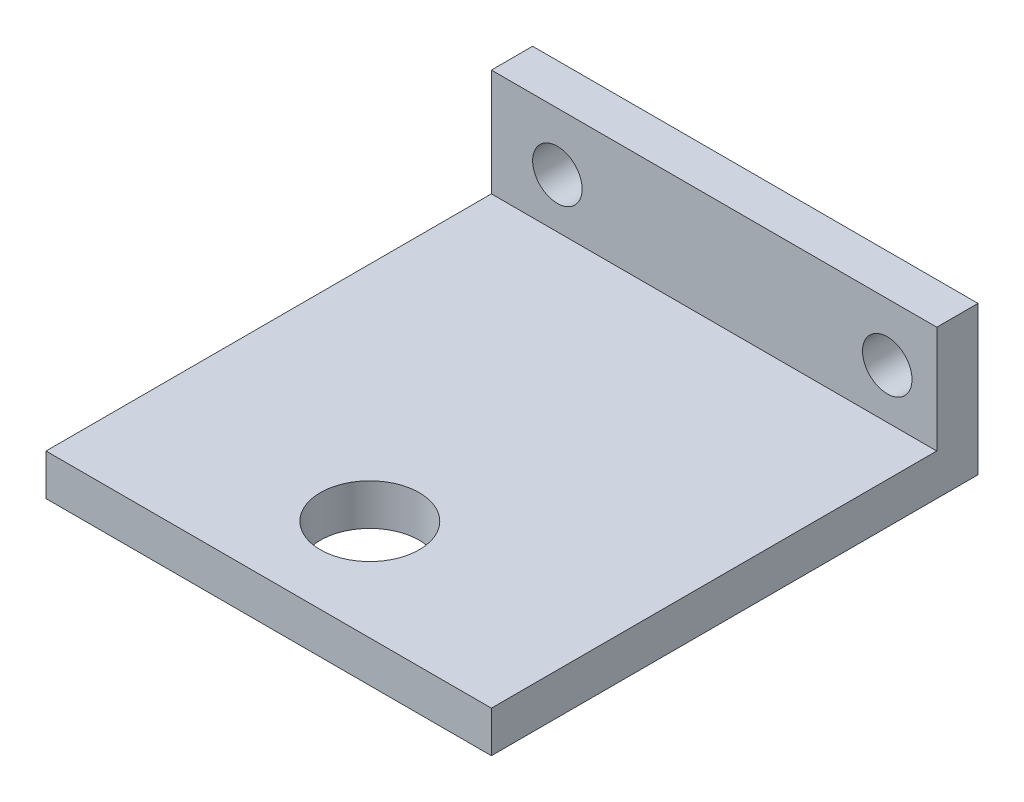
ISO-10303-21;
HEADER;
FILE_DESCRIPTION(('STEP AP214'),'2;1');
FILE_NAME('part.step','',(''),(''),'','','');
FILE_SCHEMA(('AUTOMOTIVE_DESIGN { 1 0 10303 214 1 1 1 1 }'));
ENDSEC;
DATA;
#1=APPLICATION_CONTEXT('core data for automotive mechanical design processes');
#2=APPLICATION_PROTOCOL_DEFINITION('international standard','automotive_design',2000,#1);
#3=PRODUCT_CONTEXT('',#1,'mechanical');
#4=PRODUCT('Part','Part','',(#3));
#5=PRODUCT_RELATED_PRODUCT_CATEGORY('part','',(#4));
#6=PRODUCT_DEFINITION_FORMATION('','',#4);
#7=PRODUCT_DEFINITION_CONTEXT('part definition',#1,'design');
#8=PRODUCT_DEFINITION('design','',#6,#7);
#9=PRODUCT_DEFINITION_SHAPE('','',#8);
#10=(LENGTH_UNIT() NAMED_UNIT(*) SI_UNIT(.MILLI.,.METRE.));
#11=(NAMED_UNIT(*) PLANE_ANGLE_UNIT() SI_UNIT($,.RADIAN.));
#12=(NAMED_UNIT(*) SI_UNIT($,.STERADIAN.) SOLID_ANGLE_UNIT());
#13=UNCERTAINTY_MEASURE_WITH_UNIT(LENGTH_MEASURE(1.E-05),#10,'distance_accuracy_value','');
#14=(GEOMETRIC_REPRESENTATION_CONTEXT(3) GLOBAL_UNCERTAINTY_ASSIGNED_CONTEXT((#13)) GLOBAL_UNIT_ASSIGNED_CONTEXT((#10,
#11,#12)) REPRESENTATION_CONTEXT('',''));
#15=CARTESIAN_POINT('',(0.,0.,0.));
#16=DIRECTION('',(0.,0.,1.));
#17=DIRECTION('',(1.,0.,0.));
#18=AXIS2_PLACEMENT_3D('',#15,#16,#17);
#19=CARTESIAN_POINT('',(0.,0.,59.));
#20=DIRECTION('',(0.,0.,-1.));
#21=DIRECTION('',(-1.,0.,0.));
#22=AXIS2_PLACEMENT_3D('',#19,#20,#21);
#23=PLANE('',#22);
#24=DIRECTION('',(1.,0.,0.));
#25=VECTOR('',#24,1.);
#26=CARTESIAN_POINT('',(0.,-4.,59.));
#27=LINE('',#26,#25);
#28=CARTESIAN_POINT('',(-27.,-4.,59.));
#29=VERTEX_POINT('',#28);
#30=CARTESIAN_POINT('',(27.,-4.,59.));
#31=VERTEX_POINT('',#30);
#32=EDGE_CURVE('E132',#29,#31,#27,.T.);
#33=ORIENTED_EDGE('',*,*,#32,.F.);
#34=DIRECTION('',(0.,-1.,0.));
#35=VECTOR('',#34,1.);
#36=CARTESIAN_POINT('',(-27.,-8.99999999999999,59.));
#37=LINE('',#36,#35);
#38=CARTESIAN_POINT('',(-27.,-8.99999999999999,59.));
#39=VERTEX_POINT('',#38);
#40=EDGE_CURVE('E139',#29,#39,#37,.T.);
#41=ORIENTED_EDGE('',*,*,#40,.T.);
#42=DIRECTION('',(1.,0.,0.));
#43=VECTOR('',#42,1.);
#44=CARTESIAN_POINT('',(-27.,-8.99999999999999,59.));
#45=LINE('',#44,#43);
#46=CARTESIAN_POINT('',(27.,-8.99999999999999,59.));
#47=VERTEX_POINT('',#46);
#48=EDGE_CURVE('E55',#39,#47,#45,.T.);
#49=ORIENTED_EDGE('',*,*,#48,.T.);
#50=DIRECTION('',(0.,1.,0.));
#51=VECTOR('',#50,1.);
#52=CARTESIAN_POINT('',(27.,-8.99999999999999,59.));
#53=LINE('',#52,#51);
#54=EDGE_CURVE('E84',#47,#31,#53,.T.);
#55=ORIENTED_EDGE('',*,*,#54,.T.);
#56=EDGE_LOOP('',(#33,#41,#49,#55));
#57=FACE_BOUND('',#56,.T.);
#58=ADVANCED_FACE('F32',(#57),#23,.F.);
#59=CARTESIAN_POINT('',(0.,0.,0.));
#60=DIRECTION('',(0.,0.,-1.));
#61=DIRECTION('',(-1.,0.,0.));
#62=AXIS2_PLACEMENT_3D('',#59,#60,#61);
#63=PLANE('',#62);
#64=CARTESIAN_POINT('',(-19.,2.,0.));
#65=DIRECTION('',(0.,0.,1.));
#66=DIRECTION('',(1.,0.,0.));
#67=AXIS2_PLACEMENT_3D('',#64,#65,#66);
#68=CIRCLE('',#67,3.);
#69=CARTESIAN_POINT('',(-16.,2.,0.));
#70=VERTEX_POINT('',#69);
#71=EDGE_CURVE('E98',#70,#70,#68,.T.);
#72=ORIENTED_EDGE('',*,*,#71,.T.);
#73=EDGE_LOOP('',(#72));
#74=FACE_BOUND('',#73,.T.);
#75=DIRECTION('',(0.,1.,0.));
#76=VECTOR('',#75,1.);
#77=CARTESIAN_POINT('',(27.,-8.99999999999999,0.));
#78=LINE('',#77,#76);
#79=CARTESIAN_POINT('',(27.,-8.99999999999999,0.));
#80=VERTEX_POINT('',#79);
#81=CARTESIAN_POINT('',(27.,9.,0.));
#82=VERTEX_POINT('',#81);
#83=EDGE_CURVE('E90',#80,#82,#78,.T.);
#84=ORIENTED_EDGE('',*,*,#83,.F.);
#85=DIRECTION('',(1.,0.,0.));
#86=VECTOR('',#85,1.);
#87=CARTESIAN_POINT('',(-27.,-8.99999999999999,0.));
#88=LINE('',#87,#86);
#89=CARTESIAN_POINT('',(-27.,-8.99999999999999,0.));
#90=VERTEX_POINT('',#89);
#91=EDGE_CURVE('E74',#90,#80,#88,.T.);
#92=ORIENTED_EDGE('',*,*,#91,.F.);
#93=DIRECTION('',(0.,-1.,0.));
#94=VECTOR('',#93,1.);
#95=CARTESIAN_POINT('',(-27.,-8.99999999999999,0.));
#96=LINE('',#95,#94);
#97=CARTESIAN_POINT('',(-27.,9.,0.));
#98=VERTEX_POINT('',#97);
#99=EDGE_CURVE('E85',#98,#90,#96,.T.);
#100=ORIENTED_EDGE('',*,*,#99,.F.);
#101=DIRECTION('',(-1.,0.,0.));
#102=VECTOR('',#101,1.);
#103=CARTESIAN_POINT('',(-27.,9.,0.));
#104=LINE('',#103,#102);
#105=EDGE_CURVE('E97',#82,#98,#104,.T.);
#106=ORIENTED_EDGE('',*,*,#105,.F.);
#107=EDGE_LOOP('',(#84,#92,#100,#106));
#108=FACE_BOUND('',#107,.T.);
#109=CARTESIAN_POINT('',(21.,2.,0.));
#110=DIRECTION('',(0.,0.,1.));
#111=DIRECTION('',(1.,0.,0.));
#112=AXIS2_PLACEMENT_3D('',#109,#110,#111);
#113=CIRCLE('',#112,3.);
#114=CARTESIAN_POINT('',(24.,2.,0.));
#115=VERTEX_POINT('',#114);
#116=EDGE_CURVE('E102',#115,#115,#113,.T.);
#117=ORIENTED_EDGE('',*,*,#116,.T.);
#118=EDGE_LOOP('',(#117));
#119=FACE_BOUND('',#118,.T.);
#120=ADVANCED_FACE('F94',(#74,#108,#119),#63,.T.);
#121=CARTESIAN_POINT('',(27.,-8.99999999999999,59.));
#122=DIRECTION('',(-1.,0.,0.));
#123=DIRECTION('',(0.,0.,1.));
#124=AXIS2_PLACEMENT_3D('',#121,#122,#123);
#125=PLANE('',#124);
#126=DIRECTION('',(0.,0.,-1.));
#127=VECTOR('',#126,1.);
#128=CARTESIAN_POINT('',(27.,9.,59.));
#129=LINE('',#128,#127);
#130=CARTESIAN_POINT('',(27.,9.,5.));
#131=VERTEX_POINT('',#130);
#132=EDGE_CURVE('E40',#131,#82,#129,.T.);
#133=ORIENTED_EDGE('',*,*,#132,.F.);
#134=DIRECTION('',(0.,-1.,0.));
#135=VECTOR('',#134,1.);
#136=CARTESIAN_POINT('',(27.,-8.99999999999999,5.));
#137=LINE('',#136,#135);
#138=CARTESIAN_POINT('',(27.,-4.,5.));
#139=VERTEX_POINT('',#138);
#140=EDGE_CURVE('E129',#131,#139,#137,.T.);
#141=ORIENTED_EDGE('',*,*,#140,.T.);
#142=DIRECTION('',(0.,0.,-1.));
#143=VECTOR('',#142,1.);
#144=CARTESIAN_POINT('',(27.,-4.,59.));
#145=LINE('',#144,#143);
#146=EDGE_CURVE('E135',#31,#139,#145,.T.);
#147=ORIENTED_EDGE('',*,*,#146,.F.);
#148=ORIENTED_EDGE('',*,*,#54,.F.);
#149=DIRECTION('',(0.,0.,-1.));
#150=VECTOR('',#149,1.);
#151=CARTESIAN_POINT('',(27.,-8.99999999999999,59.));
#152=LINE('',#151,#150);
#153=EDGE_CURVE('E77',#47,#80,#152,.T.);
#154=ORIENTED_EDGE('',*,*,#153,.T.);
#155=ORIENTED_EDGE('',*,*,#83,.T.);
#156=EDGE_LOOP('',(#133,#141,#147,#148,#154,#155));
#157=FACE_BOUND('',#156,.T.);
#158=ADVANCED_FACE('F34',(#157),#125,.F.);
#159=CARTESIAN_POINT('',(-27.,9.,59.));
#160=DIRECTION('',(0.,-1.,0.));
#161=DIRECTION('',(0.,0.,-1.));
#162=AXIS2_PLACEMENT_3D('',#159,#160,#161);
#163=PLANE('',#162);
#164=DIRECTION('',(0.,0.,-1.));
#165=VECTOR('',#164,1.);
#166=CARTESIAN_POINT('',(-27.,9.,59.));
#167=LINE('',#166,#165);
#168=CARTESIAN_POINT('',(-27.,9.,5.));
#169=VERTEX_POINT('',#168);
#170=EDGE_CURVE('E109',#169,#98,#167,.T.);
#171=ORIENTED_EDGE('',*,*,#170,.F.);
#172=DIRECTION('',(-1.,0.,0.));
#173=VECTOR('',#172,1.);
#174=CARTESIAN_POINT('',(42.5059230736906,9.,5.));
#175=LINE('',#174,#173);
#176=EDGE_CURVE('E119',#131,#169,#175,.T.);
#177=ORIENTED_EDGE('',*,*,#176,.F.);
#178=ORIENTED_EDGE('',*,*,#132,.T.);
#179=ORIENTED_EDGE('',*,*,#105,.T.);
#180=EDGE_LOOP('',(#171,#177,#178,#179));
#181=FACE_BOUND('',#180,.T.);
#182=ADVANCED_FACE('F150',(#181),#163,.F.);
#183=CARTESIAN_POINT('',(-27.,-8.99999999999999,59.));
#184=DIRECTION('',(1.,0.,0.));
#185=DIRECTION('',(0.,0.,-1.));
#186=AXIS2_PLACEMENT_3D('',#183,#184,#185);
#187=PLANE('',#186);
#188=DIRECTION('',(0.,0.,1.));
#189=VECTOR('',#188,1.);
#190=CARTESIAN_POINT('',(-27.,-4.,59.));
#191=LINE('',#190,#189);
#192=CARTESIAN_POINT('',(-27.,-4.,5.));
#193=VERTEX_POINT('',#192);
#194=EDGE_CURVE('E11',#193,#29,#191,.T.);
#195=ORIENTED_EDGE('',*,*,#194,.F.);
#196=DIRECTION('',(0.,1.,0.));
#197=VECTOR('',#196,1.);
#198=CARTESIAN_POINT('',(-27.,-8.99999999999999,5.));
#199=LINE('',#198,#197);
#200=EDGE_CURVE('E117',#193,#169,#199,.T.);
#201=ORIENTED_EDGE('',*,*,#200,.T.);
#202=ORIENTED_EDGE('',*,*,#170,.T.);
#203=ORIENTED_EDGE('',*,*,#99,.T.);
#204=DIRECTION('',(0.,0.,-1.));
#205=VECTOR('',#204,1.);
#206=CARTESIAN_POINT('',(-27.,-8.99999999999999,59.));
#207=LINE('',#206,#205);
#208=EDGE_CURVE('E80',#39,#90,#207,.T.);
#209=ORIENTED_EDGE('',*,*,#208,.F.);
#210=ORIENTED_EDGE('',*,*,#40,.F.);
#211=EDGE_LOOP('',(#195,#201,#202,#203,#209,#210));
#212=FACE_BOUND('',#211,.T.);
#213=ADVANCED_FACE('F145',(#212),#187,.F.);
#214=CARTESIAN_POINT('',(-27.,-8.99999999999999,59.));
#215=DIRECTION('',(0.,1.,0.));
#216=DIRECTION('',(0.,0.,1.));
#217=AXIS2_PLACEMENT_3D('',#214,#215,#216);
#218=PLANE('',#217);
#219=CARTESIAN_POINT('',(0.,-8.99999999999999,46.74));
#220=DIRECTION('',(0.,1.,0.));
#221=DIRECTION('',(0.,0.,1.));
#222=AXIS2_PLACEMENT_3D('',#219,#220,#221);
#223=CIRCLE('',#222,6.);
#224=CARTESIAN_POINT('',(0.,-9.,52.74));
#225=VERTEX_POINT('',#224);
#226=EDGE_CURVE('E122',#225,#225,#223,.T.);
#227=ORIENTED_EDGE('',*,*,#226,.T.);
#228=EDGE_LOOP('',(#227));
#229=FACE_BOUND('',#228,.T.);
#230=ORIENTED_EDGE('',*,*,#91,.T.);
#231=ORIENTED_EDGE('',*,*,#153,.F.);
#232=ORIENTED_EDGE('',*,*,#48,.F.);
#233=ORIENTED_EDGE('',*,*,#208,.T.);
#234=EDGE_LOOP('',(#230,#231,#232,#233));
#235=FACE_BOUND('',#234,.T.);
#236=ADVANCED_FACE('F76',(#229,#235),#218,.F.);
#237=CARTESIAN_POINT('',(-19.,2.,59.));
#238=DIRECTION('',(0.,0.,-1.));
#239=DIRECTION('',(-1.,0.,0.));
#240=AXIS2_PLACEMENT_3D('',#237,#238,#239);
#241=CYLINDRICAL_SURFACE('',#240,3.);
#242=CARTESIAN_POINT('',(-19.,2.,5.));
#243=DIRECTION('',(0.,0.,-1.));
#244=DIRECTION('',(-1.,0.,0.));
#245=AXIS2_PLACEMENT_3D('',#242,#243,#244);
#246=CIRCLE('',#245,3.);
#247=CARTESIAN_POINT('',(-22.,2.,5.));
#248=VERTEX_POINT('',#247);
#249=EDGE_CURVE('E113',#248,#248,#246,.T.);
#250=ORIENTED_EDGE('',*,*,#249,.F.);
#251=EDGE_LOOP('',(#250));
#252=FACE_BOUND('',#251,.T.);
#253=ORIENTED_EDGE('',*,*,#71,.F.);
#254=EDGE_LOOP('',(#253));
#255=FACE_BOUND('',#254,.T.);
#256=ADVANCED_FACE('F183',(#252,#255),#241,.F.);
#257=CARTESIAN_POINT('',(21.,2.,59.));
#258=DIRECTION('',(0.,0.,-1.));
#259=DIRECTION('',(-1.,0.,0.));
#260=AXIS2_PLACEMENT_3D('',#257,#258,#259);
#261=CYLINDRICAL_SURFACE('',#260,3.);
#262=CARTESIAN_POINT('',(21.,2.,5.));
#263=DIRECTION('',(0.,0.,-1.));
#264=DIRECTION('',(-1.,0.,0.));
#265=AXIS2_PLACEMENT_3D('',#262,#263,#264);
#266=CIRCLE('',#265,3.);
#267=CARTESIAN_POINT('',(18.,2.,5.));
#268=VERTEX_POINT('',#267);
#269=EDGE_CURVE('E111',#268,#268,#266,.T.);
#270=ORIENTED_EDGE('',*,*,#269,.F.);
#271=EDGE_LOOP('',(#270));
#272=FACE_BOUND('',#271,.T.);
#273=ORIENTED_EDGE('',*,*,#116,.F.);
#274=EDGE_LOOP('',(#273));
#275=FACE_BOUND('',#274,.T.);
#276=ADVANCED_FACE('F171',(#272,#275),#261,.F.);
#277=CARTESIAN_POINT('',(0.,-4.,0.));
#278=DIRECTION('',(0.,1.,0.));
#279=DIRECTION('',(0.,0.,1.));
#280=AXIS2_PLACEMENT_3D('',#277,#278,#279);
#281=PLANE('',#280);
#282=CARTESIAN_POINT('',(0.,-4.,46.74));
#283=DIRECTION('',(0.,1.,0.));
#284=DIRECTION('',(0.,0.,1.));
#285=AXIS2_PLACEMENT_3D('',#282,#283,#284);
#286=CIRCLE('',#285,6.);
#287=CARTESIAN_POINT('',(0.,-4.,52.74));
#288=VERTEX_POINT('',#287);
#289=EDGE_CURVE('E265',#288,#288,#286,.T.);
#290=ORIENTED_EDGE('',*,*,#289,.F.);
#291=EDGE_LOOP('',(#290));
#292=FACE_BOUND('',#291,.T.);
#293=ORIENTED_EDGE('',*,*,#146,.T.);
#294=DIRECTION('',(-1.,0.,0.));
#295=VECTOR('',#294,1.);
#296=CARTESIAN_POINT('',(42.5059230736906,-4.,5.));
#297=LINE('',#296,#295);
#298=EDGE_CURVE('E46',#139,#193,#297,.T.);
#299=ORIENTED_EDGE('',*,*,#298,.T.);
#300=ORIENTED_EDGE('',*,*,#194,.T.);
#301=ORIENTED_EDGE('',*,*,#32,.T.);
#302=EDGE_LOOP('',(#293,#299,#300,#301));
#303=FACE_BOUND('',#302,.T.);
#304=ADVANCED_FACE('F159',(#292,#303),#281,.T.);
#305=CARTESIAN_POINT('',(42.5059230736906,-4.,5.));
#306=DIRECTION('',(0.,0.,-1.));
#307=DIRECTION('',(-1.,0.,0.));
#308=AXIS2_PLACEMENT_3D('',#305,#306,#307);
#309=PLANE('',#308);
#310=ORIENTED_EDGE('',*,*,#249,.T.);
#311=EDGE_LOOP('',(#310));
#312=FACE_BOUND('',#311,.T.);
#313=ORIENTED_EDGE('',*,*,#269,.T.);
#314=EDGE_LOOP('',(#313));
#315=FACE_BOUND('',#314,.T.);
#316=ORIENTED_EDGE('',*,*,#176,.T.);
#317=ORIENTED_EDGE('',*,*,#200,.F.);
#318=ORIENTED_EDGE('',*,*,#298,.F.);
#319=ORIENTED_EDGE('',*,*,#140,.F.);
#320=EDGE_LOOP('',(#316,#317,#318,#319));
#321=FACE_BOUND('',#320,.T.);
#322=ADVANCED_FACE('F160',(#312,#315,#321),#309,.F.);
#323=CARTESIAN_POINT('',(0.,-17.,46.74));
#324=DIRECTION('',(0.,1.,0.));
#325=DIRECTION('',(0.,0.,1.));
#326=AXIS2_PLACEMENT_3D('',#323,#324,#325);
#327=CYLINDRICAL_SURFACE('',#326,6.);
#328=CARTESIAN_POINT('',(0.,-4.,52.74));
#329=CARTESIAN_POINT('',(0.,-4.05208333333333,52.74));
#330=CARTESIAN_POINT('',(0.,-4.10416666666667,52.74));
#331=CARTESIAN_POINT('',(0.,-4.20833333333333,52.74));
#332=CARTESIAN_POINT('',(0.,-4.26041666666667,52.74));
#333=CARTESIAN_POINT('',(0.,-4.36458333333333,52.74));
#334=CARTESIAN_POINT('',(0.,-4.41666666666667,52.74));
#335=CARTESIAN_POINT('',(0.,-4.52083333333333,52.74));
#336=CARTESIAN_POINT('',(0.,-4.57291666666667,52.74));
#337=CARTESIAN_POINT('',(0.,-4.67708333333333,52.74));
#338=CARTESIAN_POINT('',(0.,-4.72916666666666,52.74));
#339=CARTESIAN_POINT('',(0.,-4.83333333333333,52.74));
#340=CARTESIAN_POINT('',(0.,-4.88541666666666,52.74));
#341=CARTESIAN_POINT('',(0.,-4.98958333333333,52.74));
#342=CARTESIAN_POINT('',(0.,-5.04166666666666,52.74));
#343=CARTESIAN_POINT('',(0.,-5.14583333333333,52.74));
#344=CARTESIAN_POINT('',(0.,-5.19791666666666,52.74));
#345=CARTESIAN_POINT('',(0.,-5.30208333333333,52.74));
#346=CARTESIAN_POINT('',(0.,-5.35416666666666,52.74));
#347=CARTESIAN_POINT('',(0.,-5.45833333333333,52.74));
#348=CARTESIAN_POINT('',(0.,-5.51041666666666,52.74));
#349=CARTESIAN_POINT('',(0.,-5.61458333333333,52.74));
#350=CARTESIAN_POINT('',(0.,-5.66666666666666,52.74));
#351=CARTESIAN_POINT('',(0.,-5.77083333333333,52.74));
#352=CARTESIAN_POINT('',(0.,-5.82291666666666,52.74));
#353=CARTESIAN_POINT('',(0.,-5.92708333333333,52.74));
#354=CARTESIAN_POINT('',(0.,-5.97916666666666,52.74));
#355=CARTESIAN_POINT('',(0.,-6.08333333333333,52.74));
#356=CARTESIAN_POINT('',(0.,-6.13541666666666,52.74));
#357=CARTESIAN_POINT('',(0.,-6.23958333333333,52.74));
#358=CARTESIAN_POINT('',(0.,-6.29166666666666,52.74));
#359=CARTESIAN_POINT('',(0.,-6.39583333333333,52.74));
#360=CARTESIAN_POINT('',(0.,-6.44791666666666,52.74));
#361=CARTESIAN_POINT('',(0.,-6.55208333333333,52.74));
#362=CARTESIAN_POINT('',(0.,-6.60416666666666,52.74));
#363=CARTESIAN_POINT('',(0.,-6.70833333333333,52.74));
#364=CARTESIAN_POINT('',(0.,-6.76041666666666,52.74));
#365=CARTESIAN_POINT('',(0.,-6.86458333333333,52.74));
#366=CARTESIAN_POINT('',(0.,-6.91666666666666,52.74));
#367=CARTESIAN_POINT('',(0.,-7.02083333333333,52.74));
#368=CARTESIAN_POINT('',(0.,-7.07291666666666,52.74));
#369=CARTESIAN_POINT('',(0.,-7.17708333333333,52.74));
#370=CARTESIAN_POINT('',(0.,-7.22916666666666,52.74));
#371=CARTESIAN_POINT('',(0.,-7.33333333333333,52.74));
#372=CARTESIAN_POINT('',(0.,-7.38541666666666,52.74));
#373=CARTESIAN_POINT('',(0.,-7.48958333333333,52.74));
#374=CARTESIAN_POINT('',(0.,-7.54166666666666,52.74));
#375=CARTESIAN_POINT('',(0.,-7.64583333333333,52.74));
#376=CARTESIAN_POINT('',(0.,-7.69791666666666,52.74));
#377=CARTESIAN_POINT('',(0.,-7.80208333333333,52.74));
#378=CARTESIAN_POINT('',(0.,-7.85416666666666,52.74));
#379=CARTESIAN_POINT('',(0.,-7.95833333333333,52.74));
#380=CARTESIAN_POINT('',(0.,-8.01041666666666,52.74));
#381=CARTESIAN_POINT('',(0.,-8.11458333333333,52.74));
#382=CARTESIAN_POINT('',(0.,-8.16666666666666,52.74));
#383=CARTESIAN_POINT('',(0.,-8.27083333333333,52.74));
#384=CARTESIAN_POINT('',(0.,-8.32291666666666,52.74));
#385=CARTESIAN_POINT('',(0.,-8.42708333333333,52.74));
#386=CARTESIAN_POINT('',(0.,-8.47916666666666,52.74));
#387=CARTESIAN_POINT('',(0.,-8.58333333333333,52.74));
#388=CARTESIAN_POINT('',(0.,-8.63541666666666,52.74));
#389=CARTESIAN_POINT('',(0.,-8.73958333333333,52.74));
#390=CARTESIAN_POINT('',(0.,-8.79166666666666,52.74));
#391=CARTESIAN_POINT('',(0.,-8.89583333333333,52.74));
#392=CARTESIAN_POINT('',(0.,-8.94791666666666,52.74));
#393=CARTESIAN_POINT('',(0.,-9.,52.74));
#394=B_SPLINE_CURVE_WITH_KNOTS('',3,(#328,#329,#330,#331,#332,#333,#334,#335,#336,#337,#338,
#339,#340,#341,#342,#343,#344,#345,#346,#347,#348,#349,#350,#351,#352,#353,#354,#355,#356,#357,
#358,#359,#360,#361,#362,#363,#364,#365,#366,#367,#368,#369,#370,#371,#372,#373,#374,#375,#376,
#377,#378,#379,#380,#381,#382,#383,#384,#385,#386,#387,#388,#389,#390,#391,#392,#393),
.UNSPECIFIED.,.F.,.F.,(4,2,2,2,2,2,2,2,2,2,2,2,2,2,2,2,2,2,2,2,2,2,2,2,2,2,2,2,2,2,2,2,4),(0.,
0.15625,0.3125,0.46875,0.625000000000001,0.781249999999999,0.937499999999999,1.09375,1.25,
1.40625,1.5625,1.71875,1.875,2.03125,2.1875,2.34375,2.5,2.65625,2.8125,2.96875,3.125,3.28125,
3.4375,3.59375,3.75,3.90625,4.0625,4.21875,4.375,4.53125,4.6875,4.84375,5.),.UNSPECIFIED.);
#395=EDGE_CURVE('BSEAM162',#288,#225,#394,.T.);
#396=ORIENTED_EDGE('',*,*,#289,.T.);
#397=ORIENTED_EDGE('',*,*,#226,.F.);
#398=ORIENTED_EDGE('',*,*,#395,.T.);
#399=ORIENTED_EDGE('',*,*,#395,.F.);
#400=EDGE_LOOP('',(#396,#398,#397,#399));
#401=FACE_BOUND('',#400,.T.);
#402=ADVANCED_FACE('F162',(#401),#327,.F.);
#403=CLOSED_SHELL('',(#58,#120,#158,#182,#213,#236,#256,#276,#304,#322,#402));
#404=MANIFOLD_SOLID_BREP('B2',#403);
#405=ADVANCED_BREP_SHAPE_REPRESENTATION('',(#18,#404),#14);
#406=SHAPE_DEFINITION_REPRESENTATION(#9,#405);
ENDSEC;
END-ISO-10303-21;
